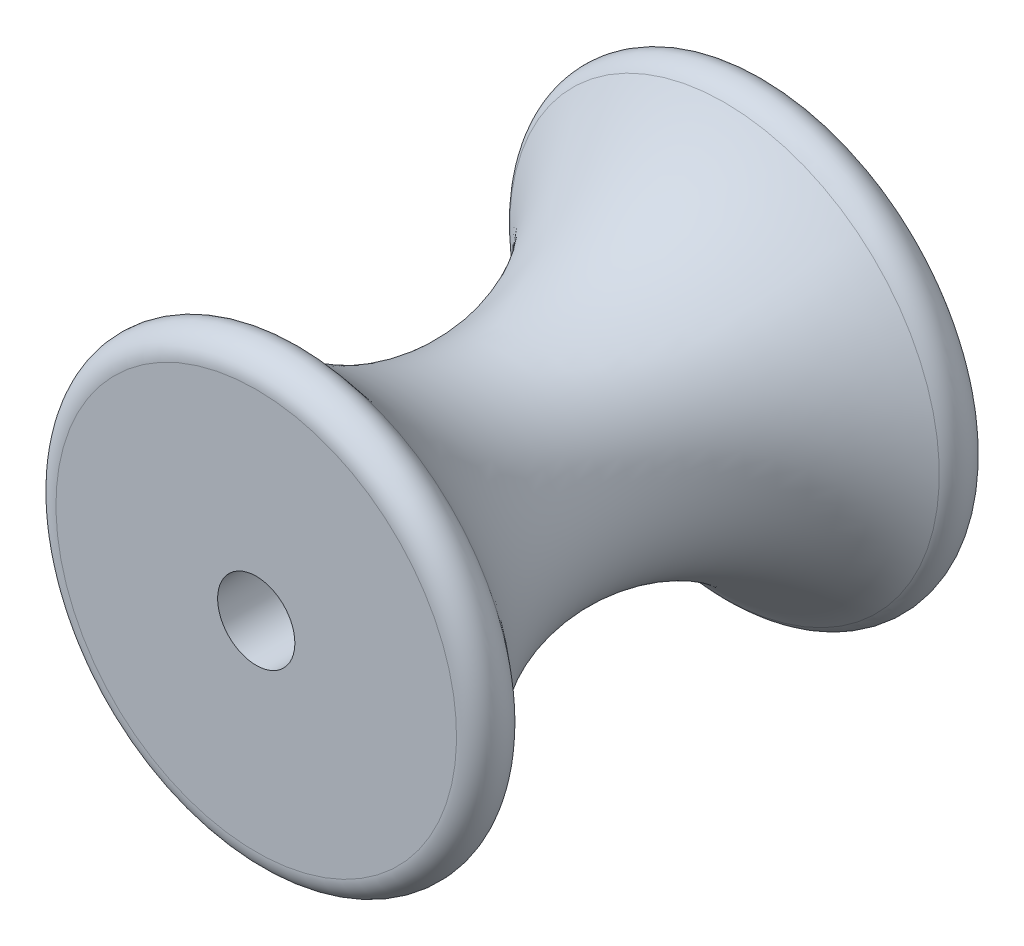
ISO-10303-21;
HEADER;
FILE_DESCRIPTION(('STEP AP214'),'2;1');
FILE_NAME('part.step','',(''),(''),'','','');
FILE_SCHEMA(('AUTOMOTIVE_DESIGN { 1 0 10303 214 1 1 1 1 }'));
ENDSEC;
DATA;
#1=APPLICATION_CONTEXT('core data for automotive mechanical design processes');
#2=APPLICATION_PROTOCOL_DEFINITION('international standard','automotive_design',2000,#1);
#3=PRODUCT_CONTEXT('',#1,'mechanical');
#4=PRODUCT('Part','Part','',(#3));
#5=PRODUCT_RELATED_PRODUCT_CATEGORY('part','',(#4));
#6=PRODUCT_DEFINITION_FORMATION('','',#4);
#7=PRODUCT_DEFINITION_CONTEXT('part definition',#1,'design');
#8=PRODUCT_DEFINITION('design','',#6,#7);
#9=PRODUCT_DEFINITION_SHAPE('','',#8);
#10=(LENGTH_UNIT() NAMED_UNIT(*) SI_UNIT(.MILLI.,.METRE.));
#11=(NAMED_UNIT(*) PLANE_ANGLE_UNIT() SI_UNIT($,.RADIAN.));
#12=(NAMED_UNIT(*) SI_UNIT($,.STERADIAN.) SOLID_ANGLE_UNIT());
#13=UNCERTAINTY_MEASURE_WITH_UNIT(LENGTH_MEASURE(1.E-05),#10,'distance_accuracy_value','');
#14=(GEOMETRIC_REPRESENTATION_CONTEXT(3) GLOBAL_UNCERTAINTY_ASSIGNED_CONTEXT((#13)) GLOBAL_UNIT_ASSIGNED_CONTEXT((#10,
#11,#12)) REPRESENTATION_CONTEXT('',''));
#15=CARTESIAN_POINT('',(0.,0.,0.));
#16=DIRECTION('',(0.,0.,1.));
#17=DIRECTION('',(1.,0.,0.));
#18=AXIS2_PLACEMENT_3D('',#15,#16,#17);
#19=CARTESIAN_POINT('',(0.,0.,-10.6));
#20=DIRECTION('',(0.,0.,-1.));
#21=DIRECTION('',(0.,1.,0.));
#22=AXIS2_PLACEMENT_3D('',#19,#20,#21);
#23=PLANE('',#22);
#24=CARTESIAN_POINT('',(0.,0.,-10.6));
#25=DIRECTION('',(0.,0.,-1.));
#26=DIRECTION('',(0.,1.,0.));
#27=AXIS2_PLACEMENT_3D('',#24,#25,#26);
#28=CIRCLE('',#27,8.3);
#29=CARTESIAN_POINT('',(0.,8.3,-10.6));
#30=VERTEX_POINT('',#29);
#31=EDGE_CURVE('E10',#30,#30,#28,.T.);
#32=ORIENTED_EDGE('',*,*,#31,.T.);
#33=EDGE_LOOP('',(#32));
#34=FACE_BOUND('',#33,.T.);
#35=CARTESIAN_POINT('',(0.,0.,-10.6));
#36=DIRECTION('',(0.,0.,-1.));
#37=DIRECTION('',(0.,1.,0.));
#38=AXIS2_PLACEMENT_3D('',#35,#36,#37);
#39=CIRCLE('',#38,1.60000000000001);
#40=CARTESIAN_POINT('',(0.,1.60000000000001,-10.6));
#41=VERTEX_POINT('',#40);
#42=EDGE_CURVE('E73',#41,#41,#39,.T.);
#43=ORIENTED_EDGE('',*,*,#42,.F.);
#44=EDGE_LOOP('',(#43));
#45=FACE_BOUND('',#44,.T.);
#46=ADVANCED_FACE('F45',(#34,#45),#23,.T.);
#47=CARTESIAN_POINT('',(0.,0.,0.));
#48=DIRECTION('',(0.,0.,-1.));
#49=DIRECTION('',(0.,1.,0.));
#50=AXIS2_PLACEMENT_3D('',#47,#48,#49);
#51=TOROIDAL_SURFACE('',#50,15.5,11.);
#52=CARTESIAN_POINT('',(0.,0.,8.8));
#53=DIRECTION('',(0.,0.,-1.));
#54=DIRECTION('',(0.,1.,0.));
#55=AXIS2_PLACEMENT_3D('',#52,#53,#54);
#56=CIRCLE('',#55,8.90000000000001);
#57=CARTESIAN_POINT('',(0.,8.9,8.80000000000001));
#58=VERTEX_POINT('',#57);
#59=EDGE_CURVE('E58',#58,#58,#56,.T.);
#60=ORIENTED_EDGE('',*,*,#59,.T.);
#61=EDGE_LOOP('',(#60));
#62=FACE_BOUND('',#61,.T.);
#63=CARTESIAN_POINT('',(0.,0.,-8.80000000000001));
#64=DIRECTION('',(0.,0.,1.));
#65=DIRECTION('',(0.,-1.,0.));
#66=AXIS2_PLACEMENT_3D('',#63,#64,#65);
#67=CIRCLE('',#66,8.9);
#68=CARTESIAN_POINT('',(0.,-8.9,-8.80000000000001));
#69=VERTEX_POINT('',#68);
#70=EDGE_CURVE('E63',#69,#69,#67,.T.);
#71=ORIENTED_EDGE('',*,*,#70,.T.);
#72=EDGE_LOOP('',(#71));
#73=FACE_BOUND('',#72,.T.);
#74=ADVANCED_FACE('F81',(#62,#73),#51,.F.);
#75=CARTESIAN_POINT('',(0.,0.,10.6));
#76=DIRECTION('',(0.,0.,-1.));
#77=DIRECTION('',(0.,1.,0.));
#78=AXIS2_PLACEMENT_3D('',#75,#76,#77);
#79=PLANE('',#78);
#80=CARTESIAN_POINT('',(0.,0.,10.6));
#81=DIRECTION('',(0.,0.,-1.));
#82=DIRECTION('',(0.,1.,0.));
#83=AXIS2_PLACEMENT_3D('',#80,#81,#82);
#84=CIRCLE('',#83,8.30000000000001);
#85=CARTESIAN_POINT('',(0.,8.3,10.6));
#86=VERTEX_POINT('',#85);
#87=EDGE_CURVE('E53',#86,#86,#84,.F.);
#88=ORIENTED_EDGE('',*,*,#87,.T.);
#89=EDGE_LOOP('',(#88));
#90=FACE_BOUND('',#89,.T.);
#91=CARTESIAN_POINT('',(0.,0.,10.6));
#92=DIRECTION('',(0.,0.,-1.));
#93=DIRECTION('',(0.,1.,0.));
#94=AXIS2_PLACEMENT_3D('',#91,#92,#93);
#95=CIRCLE('',#94,1.60000000000001);
#96=CARTESIAN_POINT('',(0.,1.6,10.6));
#97=VERTEX_POINT('',#96);
#98=EDGE_CURVE('E69',#97,#97,#95,.T.);
#99=ORIENTED_EDGE('',*,*,#98,.T.);
#100=EDGE_LOOP('',(#99));
#101=FACE_BOUND('',#100,.T.);
#102=ADVANCED_FACE('F87',(#90,#101),#79,.F.);
#103=CARTESIAN_POINT('',(0.,0.,-11.));
#104=DIRECTION('',(0.,0.,-1.));
#105=DIRECTION('',(0.,1.,0.));
#106=AXIS2_PLACEMENT_3D('',#103,#104,#105);
#107=CYLINDRICAL_SURFACE('',#106,1.60000000000001);
#108=ORIENTED_EDGE('',*,*,#98,.F.);
#109=EDGE_LOOP('',(#108));
#110=FACE_BOUND('',#109,.T.);
#111=ORIENTED_EDGE('',*,*,#42,.T.);
#112=EDGE_LOOP('',(#111));
#113=FACE_BOUND('',#112,.T.);
#114=ADVANCED_FACE('F78',(#110,#113),#107,.F.);
#115=CARTESIAN_POINT('',(0.,0.,9.6));
#116=DIRECTION('',(0.,0.,1.));
#117=DIRECTION('',(0.,-1.,0.));
#118=AXIS2_PLACEMENT_3D('',#115,#116,#117);
#119=TOROIDAL_SURFACE('',#118,8.30000000000001,1.);
#120=ORIENTED_EDGE('',*,*,#87,.F.);
#121=EDGE_LOOP('',(#120));
#122=FACE_BOUND('',#121,.T.);
#123=ORIENTED_EDGE('',*,*,#59,.F.);
#124=EDGE_LOOP('',(#123));
#125=FACE_BOUND('',#124,.T.);
#126=ADVANCED_FACE('F91',(#122,#125),#119,.T.);
#127=CARTESIAN_POINT('',(0.,0.,-9.6));
#128=DIRECTION('',(0.,0.,1.));
#129=DIRECTION('',(0.,-1.,0.));
#130=AXIS2_PLACEMENT_3D('',#127,#128,#129);
#131=TOROIDAL_SURFACE('',#130,8.3,1.);
#132=ORIENTED_EDGE('',*,*,#70,.F.);
#133=EDGE_LOOP('',(#132));
#134=FACE_BOUND('',#133,.T.);
#135=ORIENTED_EDGE('',*,*,#31,.F.);
#136=EDGE_LOOP('',(#135));
#137=FACE_BOUND('',#136,.T.);
#138=ADVANCED_FACE('F47',(#134,#137),#131,.T.);
#139=CLOSED_SHELL('',(#46,#74,#102,#114,#126,#138));
#140=MANIFOLD_SOLID_BREP('B2',#139);
#141=ADVANCED_BREP_SHAPE_REPRESENTATION('',(#18,#140),#14);
#142=SHAPE_DEFINITION_REPRESENTATION(#9,#141);
ENDSEC;
END-ISO-10303-21;
